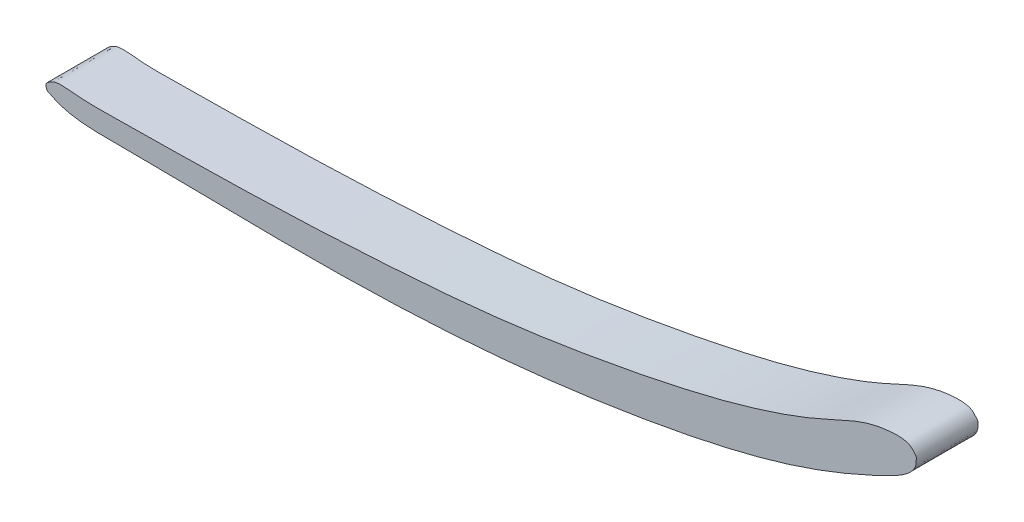
ISO-10303-21;
HEADER;
FILE_DESCRIPTION(('STEP AP214'),'2;1');
FILE_NAME('part.step','',(''),(''),'','','');
FILE_SCHEMA(('AUTOMOTIVE_DESIGN { 1 0 10303 214 1 1 1 1 }'));
ENDSEC;
DATA;
#1=APPLICATION_CONTEXT('core data for automotive mechanical design processes');
#2=APPLICATION_PROTOCOL_DEFINITION('international standard','automotive_design',2000,#1);
#3=PRODUCT_CONTEXT('',#1,'mechanical');
#4=PRODUCT('Part','Part','',(#3));
#5=PRODUCT_RELATED_PRODUCT_CATEGORY('part','',(#4));
#6=PRODUCT_DEFINITION_FORMATION('','',#4);
#7=PRODUCT_DEFINITION_CONTEXT('part definition',#1,'design');
#8=PRODUCT_DEFINITION('design','',#6,#7);
#9=PRODUCT_DEFINITION_SHAPE('','',#8);
#10=(LENGTH_UNIT() NAMED_UNIT(*) SI_UNIT(.MILLI.,.METRE.));
#11=(NAMED_UNIT(*) PLANE_ANGLE_UNIT() SI_UNIT($,.RADIAN.));
#12=(NAMED_UNIT(*) SI_UNIT($,.STERADIAN.) SOLID_ANGLE_UNIT());
#13=UNCERTAINTY_MEASURE_WITH_UNIT(LENGTH_MEASURE(1.E-05),#10,'distance_accuracy_value','');
#14=(GEOMETRIC_REPRESENTATION_CONTEXT(3) GLOBAL_UNCERTAINTY_ASSIGNED_CONTEXT((#13)) GLOBAL_UNIT_ASSIGNED_CONTEXT((#10,
#11,#12)) REPRESENTATION_CONTEXT('',''));
#15=CARTESIAN_POINT('',(0.,0.,0.));
#16=DIRECTION('',(0.,0.,1.));
#17=DIRECTION('',(1.,0.,0.));
#18=AXIS2_PLACEMENT_3D('',#15,#16,#17);
#19=CARTESIAN_POINT('',(53.3117758896389,0.,436.));
#20=CARTESIAN_POINT('',(53.2924026848462,0.0758602378564122,436.));
#21=CARTESIAN_POINT('',(53.2467278687964,0.139159285156232,436.));
#22=CARTESIAN_POINT('',(53.1503918380007,0.259806944950203,436.));
#23=CARTESIAN_POINT('',(53.0986646794505,0.317077317957271,436.));
#24=CARTESIAN_POINT('',(52.9471149825121,0.492004209302732,436.));
#25=CARTESIAN_POINT('',(52.8466524397849,0.610432508046294,436.));
#26=CARTESIAN_POINT('',(52.6783978309807,0.766979000780404,436.));
#27=CARTESIAN_POINT('',(52.619815325509,0.815905581420362,436.));
#28=CARTESIAN_POINT('',(52.4938713708062,0.902315687405925,436.));
#29=CARTESIAN_POINT('',(52.4264511640751,0.940280037854235,436.));
#30=CARTESIAN_POINT('',(52.2153503556903,1.03904826113235,436.));
#31=CARTESIAN_POINT('',(52.0684398127395,1.08283402937068,436.));
#32=CARTESIAN_POINT('',(51.7687117299037,1.14930898014529,436.));
#33=CARTESIAN_POINT('',(51.6151734363124,1.1713739842496,436.));
#34=CARTESIAN_POINT('',(51.3098346330985,1.20362471361882,436.));
#35=CARTESIAN_POINT('',(51.157314347315,1.21351271379425,436.));
#36=CARTESIAN_POINT('',(50.7001470822198,1.22671314723363,436.));
#37=CARTESIAN_POINT('',(50.3958589855501,1.21501388151934,436.));
#38=CARTESIAN_POINT('',(49.4836815115665,1.15118726270128,436.));
#39=CARTESIAN_POINT('',(48.8742839395961,1.06455727948804,436.));
#40=CARTESIAN_POINT('',(47.6837080608175,0.825848229888099,436.));
#41=CARTESIAN_POINT('',(47.0998250757884,0.671336619867735,436.));
#42=CARTESIAN_POINT('',(45.3799647546223,0.109809664935318,436.));
#43=CARTESIAN_POINT('',(44.2730236139548,-0.387008416167067,436.));
#44=CARTESIAN_POINT('',(42.6175644450478,-1.1465483464376,436.));
#45=CARTESIAN_POINT('',(42.0661760715918,-1.40089468343779,436.));
#46=CARTESIAN_POINT('',(40.958588813253,-1.8965798331248,436.));
#47=CARTESIAN_POINT('',(40.4027757567286,-2.13896191778587,436.));
#48=CARTESIAN_POINT('',(38.7244667853285,-2.83671645039119,436.));
#49=CARTESIAN_POINT('',(37.5916504515587,-3.26418269714868,436.));
#50=CARTESIAN_POINT('',(35.3079131153586,-4.07016053763645,436.));
#51=CARTESIAN_POINT('',(34.1569898158811,-4.44866592019819,436.));
#52=CARTESIAN_POINT('',(31.8413286131121,-5.16832227972006,436.));
#53=CARTESIAN_POINT('',(30.6755818504296,-5.50871704075062,436.));
#54=CARTESIAN_POINT('',(28.333861449729,-6.15079805632202,436.));
#55=CARTESIAN_POINT('',(27.1581584814709,-6.45281059441175,436.));
#56=CARTESIAN_POINT('',(23.6196897027133,-7.31421354065079,436.));
#57=CARTESIAN_POINT('',(21.24675994169,-7.83228505152961,436.));
#58=CARTESIAN_POINT('',(16.4891092780133,-8.79765761066856,436.));
#59=CARTESIAN_POINT('',(14.1030125471596,-9.24334085495504,436.));
#60=CARTESIAN_POINT('',(9.31889776092562,-10.0740415498972,436.));
#61=CARTESIAN_POINT('',(6.92125852694406,-10.4586449538477,436.));
#62=CARTESIAN_POINT('',(2.11392175098712,-11.1450967526568,436.));
#63=CARTESIAN_POINT('',(-0.295242499761816,-11.4447759492836,436.));
#64=CARTESIAN_POINT('',(-5.12188937919193,-11.9577543927274,436.));
#65=CARTESIAN_POINT('',(-7.53952796508919,-12.1733952696655,436.));
#66=CARTESIAN_POINT('',(-12.3803996562016,-12.5517177854661,436.));
#67=CARTESIAN_POINT('',(-14.8023958890144,-12.7163512181803,436.));
#68=CARTESIAN_POINT('',(-19.6481830616195,-13.0166660351802,436.));
#69=CARTESIAN_POINT('',(-22.0722733460564,-13.1493699001337,436.));
#70=CARTESIAN_POINT('',(-26.9224242304976,-13.3762304540458,436.));
#71=CARTESIAN_POINT('',(-29.3481937127747,-13.4690177971558,436.));
#72=CARTESIAN_POINT('',(-34.2010231556135,-13.6162096009974,436.));
#73=CARTESIAN_POINT('',(-36.6280914231928,-13.6715379579262,436.));
#74=CARTESIAN_POINT('',(-41.4825872822672,-13.7655224097336,436.));
#75=CARTESIAN_POINT('',(-43.909972764677,-13.8053816696377,436.));
#76=CARTESIAN_POINT('',(-47.5511189437348,-13.8600165212119,436.));
#77=CARTESIAN_POINT('',(-48.7648510065753,-13.8772794718593,436.));
#78=CARTESIAN_POINT('',(-50.5855302211102,-13.8958986816439,436.));
#79=CARTESIAN_POINT('',(-51.192434954409,-13.9023238930158,436.));
#80=CARTESIAN_POINT('',(-52.4062095603995,-13.9118440451594,436.));
#81=CARTESIAN_POINT('',(-53.0130792894998,-13.9144384814104,436.));
#82=CARTESIAN_POINT('',(-54.2265907877619,-13.8915357370193,436.));
#83=CARTESIAN_POINT('',(-54.8334826397777,-13.8641458014162,436.));
#84=CARTESIAN_POINT('',(-55.741758431794,-13.7919730245677,436.));
#85=CARTESIAN_POINT('',(-56.044112929335,-13.7607896789615,436.));
#86=CARTESIAN_POINT('',(-56.6489392616782,-13.700492071634,436.));
#87=CARTESIAN_POINT('',(-56.9515384496869,-13.6736235114415,436.));
#88=CARTESIAN_POINT('',(-57.4068281322975,-13.6578473217736,436.));
#89=CARTESIAN_POINT('',(-57.5588019686673,-13.6563023937686,436.));
#90=CARTESIAN_POINT('',(-57.8635891667981,-13.6680164324404,436.));
#91=CARTESIAN_POINT('',(-58.0175380058452,-13.681491068912,436.));
#92=CARTESIAN_POINT('',(-58.3176730522633,-13.7329422380945,436.));
#93=CARTESIAN_POINT('',(-58.4643214612019,-13.771039622849,436.));
#94=CARTESIAN_POINT('',(-58.7480308516036,-13.8819257560922,436.));
#95=CARTESIAN_POINT('',(-58.8854856347092,-13.9546166340624,436.));
#96=CARTESIAN_POINT('',(-59.0833557752634,-14.0736373733548,436.));
#97=CARTESIAN_POINT('',(-59.147986391791,-14.1155130702567,436.));
#98=CARTESIAN_POINT('',(-59.2756713392829,-14.2018820444326,436.));
#99=CARTESIAN_POINT('',(-59.3407346497934,-14.2435038852301,436.));
#100=CARTESIAN_POINT('',(-59.4305454954696,-14.3165243529279,436.));
#101=CARTESIAN_POINT('',(-59.4585925272692,-14.3432580027624,436.));
#102=CARTESIAN_POINT('',(-59.5048642521898,-14.404157568203,436.));
#103=CARTESIAN_POINT('',(-59.5235914393022,-14.4387121653684,436.));
#104=CARTESIAN_POINT('',(-59.5645465125461,-14.5460667634958,436.));
#105=CARTESIAN_POINT('',(-59.5702202832985,-14.6246168879694,436.));
#106=CARTESIAN_POINT('',(-59.5602408176723,-14.777535659201,436.));
#107=CARTESIAN_POINT('',(-59.5511499967201,-14.8541385622573,436.));
#108=CARTESIAN_POINT('',(-59.5209654665413,-15.0047636381116,436.));
#109=CARTESIAN_POINT('',(-59.4977883361542,-15.0798462968817,436.));
#110=CARTESIAN_POINT('',(-59.4117827844488,-15.2070789180144,436.));
#111=CARTESIAN_POINT('',(-59.3465119100966,-15.2519848307293,436.));
#112=CARTESIAN_POINT('',(-59.2119368740564,-15.3206032224977,436.));
#113=CARTESIAN_POINT('',(-59.1412424073977,-15.3479914414723,436.));
#114=CARTESIAN_POINT('',(-58.7949724582257,-15.4995636739074,436.));
#115=CARTESIAN_POINT('',(-58.5303965775519,-15.6489935920551,436.));
#116=CARTESIAN_POINT('',(-57.9783651911049,-15.8930036725637,436.));
#117=CARTESIAN_POINT('',(-57.6925852721282,-15.990385246316,436.));
#118=CARTESIAN_POINT('',(-57.1101426355883,-16.1577041055364,436.));
#119=CARTESIAN_POINT('',(-56.8143800231552,-16.2285402307878,436.));
#120=CARTESIAN_POINT('',(-56.2209726779825,-16.3515009001225,436.));
#121=CARTESIAN_POINT('',(-55.9223856481892,-16.403029038198,436.));
#122=CARTESIAN_POINT('',(-55.0216735747282,-16.5314510405812,436.));
#123=CARTESIAN_POINT('',(-54.4167249955589,-16.5817261414553,436.));
#124=CARTESIAN_POINT('',(-53.2073559081699,-16.6467920780263,436.));
#125=CARTESIAN_POINT('',(-52.6018239163977,-16.6625186142064,436.));
#126=CARTESIAN_POINT('',(-50.7841508903534,-16.6883383537372,436.));
#127=CARTESIAN_POINT('',(-49.5717661341431,-16.6835243764088,436.));
#128=CARTESIAN_POINT('',(-47.1475064765481,-16.6854169709471,436.));
#129=CARTESIAN_POINT('',(-45.9353913330778,-16.6899262367382,436.));
#130=CARTESIAN_POINT('',(-42.2991202853967,-16.7215008451385,436.));
#131=CARTESIAN_POINT('',(-39.8751251169339,-16.762512794779,436.));
#132=CARTESIAN_POINT('',(-35.0271191570887,-16.8388324412898,436.));
#133=CARTESIAN_POINT('',(-32.6030429125295,-16.871014753095,436.));
#134=CARTESIAN_POINT('',(-25.3301932913842,-16.916904753438,436.));
#135=CARTESIAN_POINT('',(-20.4821249895782,-16.8758608033369,436.));
#136=CARTESIAN_POINT('',(-10.7905152724948,-16.5550559898871,436.));
#137=CARTESIAN_POINT('',(-5.94956608478794,-16.2804264694768,436.));
#138=CARTESIAN_POINT('',(3.70917705833322,-15.4284327066827,436.));
#139=CARTESIAN_POINT('',(8.52438706750984,-14.8507310483279,436.));
#140=CARTESIAN_POINT('',(15.7155933474987,-13.7713937222307,436.));
#141=CARTESIAN_POINT('',(18.108570446821,-13.3767789438654,436.));
#142=CARTESIAN_POINT('',(22.877281107572,-12.5098766058601,436.));
#143=CARTESIAN_POINT('',(25.2537830166688,-12.0375555295738,436.));
#144=CARTESIAN_POINT('',(29.9843028115873,-10.9816304254003,436.));
#145=CARTESIAN_POINT('',(32.3397610649834,-10.3953357966798,436.));
#146=CARTESIAN_POINT('',(36.9988668368674,-9.05462875404475,436.));
#147=CARTESIAN_POINT('',(39.3052839376106,-8.29679195262606,436.));
#148=CARTESIAN_POINT('',(43.8421600276826,-6.58228330160254,436.));
#149=CARTESIAN_POINT('',(46.0738652129147,-5.62563738457181,436.));
#150=CARTESIAN_POINT('',(48.818732162713,-4.33680716405205,436.));
#151=CARTESIAN_POINT('',(49.365713657546,-4.07443669957599,436.));
#152=CARTESIAN_POINT('',(50.1768324571656,-3.66259874691369,436.));
#153=CARTESIAN_POINT('',(50.4452805806202,-3.52173939145187,436.));
#154=CARTESIAN_POINT('',(50.9754401492382,-3.2274908377059,436.));
#155=CARTESIAN_POINT('',(51.2380694219104,-3.07440836745271,436.));
#156=CARTESIAN_POINT('',(51.7459371827672,-2.74621649414777,436.));
#157=CARTESIAN_POINT('',(51.9913373473091,-2.57103062868122,436.));
#158=CARTESIAN_POINT('',(52.4530504108351,-2.1828587519819,436.));
#159=CARTESIAN_POINT('',(52.6706950854035,-1.96606670726904,436.));
#160=CARTESIAN_POINT('',(52.9506869887328,-1.60538994521381,436.));
#161=CARTESIAN_POINT('',(53.0368004072569,-1.47929374796479,436.));
#162=CARTESIAN_POINT('',(53.1818406642536,-1.20937749837996,436.));
#163=CARTESIAN_POINT('',(53.2395813073663,-1.06913135718228,436.));
#164=CARTESIAN_POINT('',(53.3016773198267,-0.769538125322267,436.));
#165=CARTESIAN_POINT('',(53.3024911330265,-0.613919339002539,436.));
#166=CARTESIAN_POINT('',(53.3066009239745,-0.383720642859048,436.));
#167=CARTESIAN_POINT('',(53.3112938239223,-0.307099157497964,436.));
#168=CARTESIAN_POINT('',(53.3224238492843,-0.153914667601784,436.));
#169=CARTESIAN_POINT('',(53.3311490944316,-0.0758602378564122,436.));
#170=CARTESIAN_POINT('',(53.3117758896389,0.,436.));
#171=B_SPLINE_CURVE_WITH_KNOTS('',3,(#19,#20,#21,#22,#23,#24,#25,#26,#27,#28,#29,#30,#31,#32,
#33,#34,#35,#36,#37,#38,#39,#40,#41,#42,#43,#44,#45,#46,#47,#48,#49,#50,#51,#52,#53,#54,#55,#56,
#57,#58,#59,#60,#61,#62,#63,#64,#65,#66,#67,#68,#69,#70,#71,#72,#73,#74,#75,#76,#77,#78,#79,#80,
#81,#82,#83,#84,#85,#86,#87,#88,#89,#90,#91,#92,#93,#94,#95,#96,#97,#98,#99,#100,#101,#102,#103,
#104,#105,#106,#107,#108,#109,#110,#111,#112,#113,#114,#115,#116,#117,#118,#119,#120,#121,#122,
#123,#124,#125,#126,#127,#128,#129,#130,#131,#132,#133,#134,#135,#136,#137,#138,#139,#140,#141,
#142,#143,#144,#145,#146,#147,#148,#149,#150,#151,#152,#153,#154,#155,#156,#157,#158,#159,#160,
#161,#162,#163,#164,#165,#166,#167,#168,#169,#170),.UNSPECIFIED.,.T.,.F.,(4,2,2,2,2,2,2,2,2,2,2,
2,2,2,2,2,2,2,2,2,2,2,2,2,2,2,2,2,2,2,2,2,2,2,2,2,2,2,2,2,2,2,2,2,2,2,2,2,2,2,2,2,2,2,2,2,2,2,2,
2,2,2,2,2,2,2,2,2,2,2,2,2,2,2,2,4),(0.,0.000976562500000017,0.00195312500000003,
0.00390625000000001,0.0048828125,0.00585937499999999,0.00781249999999997,0.00976562499999994,
0.0117187499999999,0.0156249999999999,0.0234374999999997,0.0312499999999995,0.0468749999999992,
0.054687499999999,0.0624999999999987,0.0781249999999983,0.0937499999999979,0.109374999999997,
0.124999999999997,0.156249999999996,0.187499999999995,0.218749999999994,0.249999999999993,
0.281249999999992,0.312499999999992,0.343749999999991,0.37499999999999,0.406249999999989,
0.437499999999988,0.453124999999987,0.460937499999987,0.468749999999987,0.476562499999987,
0.480468749999987,0.484374999999987,0.486328124999987,0.488281249999987,0.490234374999987,
0.492187499999987,0.493164062499987,0.494140624999986,0.494628906249986,0.495117187499986,
0.496093749999987,0.497070312499987,0.498046874999987,0.499023437499987,0.499999999999987,
0.503906249999987,0.507812499999987,0.511718749999987,0.515624999999987,0.523437499999987,
0.531249999999987,0.546874999999988,0.562499999999988,0.593749999999989,0.62499999999999,
0.687499999999992,0.749999999999993,0.812499999999995,0.843749999999996,0.874999999999997,
0.906249999999998,0.937499999999999,0.968749999999999,0.9765625,0.98046875,0.984375,0.98828125,
0.9921875,0.994140625,0.99609375,0.998046875,0.9990234375,1.),.UNSPECIFIED.);
#172=DIRECTION('',(0.,0.,-1.));
#173=VECTOR('',#172,1.);
#174=SURFACE_OF_LINEAR_EXTRUSION('',#171,#173);
#175=CARTESIAN_POINT('',(53.3117758896389,0.,436.));
#176=CARTESIAN_POINT('',(53.3311490944316,-0.0758602378564122,436.));
#177=CARTESIAN_POINT('',(53.3224238492843,-0.153914667601784,436.));
#178=CARTESIAN_POINT('',(53.3112938239223,-0.307099157497964,436.));
#179=CARTESIAN_POINT('',(53.3066009239745,-0.383720642859048,436.));
#180=CARTESIAN_POINT('',(53.3024911330265,-0.613919339002539,436.));
#181=CARTESIAN_POINT('',(53.3016773198267,-0.769538125322267,436.));
#182=CARTESIAN_POINT('',(53.2395813073663,-1.06913135718228,436.));
#183=CARTESIAN_POINT('',(53.1818406642536,-1.20937749837996,436.));
#184=CARTESIAN_POINT('',(53.0368004072569,-1.47929374796479,436.));
#185=CARTESIAN_POINT('',(52.9506869887328,-1.60538994521381,436.));
#186=CARTESIAN_POINT('',(52.6706950854035,-1.96606670726904,436.));
#187=CARTESIAN_POINT('',(52.4530504108351,-2.1828587519819,436.));
#188=CARTESIAN_POINT('',(51.9913373473091,-2.57103062868122,436.));
#189=CARTESIAN_POINT('',(51.7459371827672,-2.74621649414777,436.));
#190=CARTESIAN_POINT('',(51.2380694219104,-3.07440836745271,436.));
#191=CARTESIAN_POINT('',(50.9754401492382,-3.2274908377059,436.));
#192=CARTESIAN_POINT('',(50.4452805806202,-3.52173939145187,436.));
#193=CARTESIAN_POINT('',(50.1768324571656,-3.66259874691369,436.));
#194=CARTESIAN_POINT('',(49.365713657546,-4.07443669957599,436.));
#195=CARTESIAN_POINT('',(48.818732162713,-4.33680716405205,436.));
#196=CARTESIAN_POINT('',(46.0738652129147,-5.62563738457181,436.));
#197=CARTESIAN_POINT('',(43.8421600276826,-6.58228330160254,436.));
#198=CARTESIAN_POINT('',(39.3052839376106,-8.29679195262606,436.));
#199=CARTESIAN_POINT('',(36.9988668368674,-9.05462875404475,436.));
#200=CARTESIAN_POINT('',(32.3397610649834,-10.3953357966798,436.));
#201=CARTESIAN_POINT('',(29.9843028115873,-10.9816304254003,436.));
#202=CARTESIAN_POINT('',(25.2537830166688,-12.0375555295738,436.));
#203=CARTESIAN_POINT('',(22.877281107572,-12.5098766058601,436.));
#204=CARTESIAN_POINT('',(18.108570446821,-13.3767789438654,436.));
#205=CARTESIAN_POINT('',(15.7155933474987,-13.7713937222307,436.));
#206=CARTESIAN_POINT('',(8.52438706750984,-14.8507310483279,436.));
#207=CARTESIAN_POINT('',(3.70917705833322,-15.4284327066827,436.));
#208=CARTESIAN_POINT('',(-5.94956608478794,-16.2804264694768,436.));
#209=CARTESIAN_POINT('',(-10.7905152724948,-16.5550559898871,436.));
#210=CARTESIAN_POINT('',(-20.4821249895782,-16.8758608033369,436.));
#211=CARTESIAN_POINT('',(-25.3301932913842,-16.916904753438,436.));
#212=CARTESIAN_POINT('',(-32.6030429125295,-16.871014753095,436.));
#213=CARTESIAN_POINT('',(-35.0271191570887,-16.8388324412898,436.));
#214=CARTESIAN_POINT('',(-39.8751251169339,-16.762512794779,436.));
#215=CARTESIAN_POINT('',(-42.2991202853967,-16.7215008451385,436.));
#216=CARTESIAN_POINT('',(-45.9353913330778,-16.6899262367382,436.));
#217=CARTESIAN_POINT('',(-47.1475064765481,-16.6854169709471,436.));
#218=CARTESIAN_POINT('',(-49.5717661341431,-16.6835243764088,436.));
#219=CARTESIAN_POINT('',(-50.7841508903534,-16.6883383537372,436.));
#220=CARTESIAN_POINT('',(-52.6018239163977,-16.6625186142064,436.));
#221=CARTESIAN_POINT('',(-53.2073559081699,-16.6467920780263,436.));
#222=CARTESIAN_POINT('',(-54.4167249955589,-16.5817261414553,436.));
#223=CARTESIAN_POINT('',(-55.0216735747282,-16.5314510405812,436.));
#224=CARTESIAN_POINT('',(-55.9223856481892,-16.403029038198,436.));
#225=CARTESIAN_POINT('',(-56.2209726779825,-16.3515009001225,436.));
#226=CARTESIAN_POINT('',(-56.8143800231552,-16.2285402307878,436.));
#227=CARTESIAN_POINT('',(-57.1101426355883,-16.1577041055364,436.));
#228=CARTESIAN_POINT('',(-57.6925852721282,-15.990385246316,436.));
#229=CARTESIAN_POINT('',(-57.9783651911049,-15.8930036725637,436.));
#230=CARTESIAN_POINT('',(-58.5303965775519,-15.6489935920551,436.));
#231=CARTESIAN_POINT('',(-58.7949724582257,-15.4995636739074,436.));
#232=CARTESIAN_POINT('',(-59.1412424073977,-15.3479914414723,436.));
#233=CARTESIAN_POINT('',(-59.2119368740564,-15.3206032224977,436.));
#234=CARTESIAN_POINT('',(-59.3465119100966,-15.2519848307293,436.));
#235=CARTESIAN_POINT('',(-59.4117827844488,-15.2070789180144,436.));
#236=CARTESIAN_POINT('',(-59.4977883361542,-15.0798462968817,436.));
#237=CARTESIAN_POINT('',(-59.5209654665413,-15.0047636381116,436.));
#238=CARTESIAN_POINT('',(-59.5511499967201,-14.8541385622573,436.));
#239=CARTESIAN_POINT('',(-59.5602408176723,-14.777535659201,436.));
#240=CARTESIAN_POINT('',(-59.5702202832985,-14.6246168879694,436.));
#241=CARTESIAN_POINT('',(-59.5645465125461,-14.5460667634958,436.));
#242=CARTESIAN_POINT('',(-59.5235914393022,-14.4387121653684,436.));
#243=CARTESIAN_POINT('',(-59.5048642521898,-14.404157568203,436.));
#244=CARTESIAN_POINT('',(-59.4585925272692,-14.3432580027624,436.));
#245=CARTESIAN_POINT('',(-59.4305454954696,-14.3165243529279,436.));
#246=CARTESIAN_POINT('',(-59.3407346497934,-14.2435038852301,436.));
#247=CARTESIAN_POINT('',(-59.2756713392829,-14.2018820444326,436.));
#248=CARTESIAN_POINT('',(-59.147986391791,-14.1155130702567,436.));
#249=CARTESIAN_POINT('',(-59.0833557752634,-14.0736373733548,436.));
#250=CARTESIAN_POINT('',(-58.8854856347092,-13.9546166340624,436.));
#251=CARTESIAN_POINT('',(-58.7480308516036,-13.8819257560922,436.));
#252=CARTESIAN_POINT('',(-58.4643214612019,-13.771039622849,436.));
#253=CARTESIAN_POINT('',(-58.3176730522633,-13.7329422380945,436.));
#254=CARTESIAN_POINT('',(-58.0175380058452,-13.681491068912,436.));
#255=CARTESIAN_POINT('',(-57.8635891667981,-13.6680164324404,436.));
#256=CARTESIAN_POINT('',(-57.5588019686673,-13.6563023937686,436.));
#257=CARTESIAN_POINT('',(-57.4068281322975,-13.6578473217736,436.));
#258=CARTESIAN_POINT('',(-56.9515384496869,-13.6736235114415,436.));
#259=CARTESIAN_POINT('',(-56.6489392616782,-13.700492071634,436.));
#260=CARTESIAN_POINT('',(-56.044112929335,-13.7607896789615,436.));
#261=CARTESIAN_POINT('',(-55.741758431794,-13.7919730245677,436.));
#262=CARTESIAN_POINT('',(-54.8334826397777,-13.8641458014162,436.));
#263=CARTESIAN_POINT('',(-54.2265907877619,-13.8915357370193,436.));
#264=CARTESIAN_POINT('',(-53.0130792894998,-13.9144384814104,436.));
#265=CARTESIAN_POINT('',(-52.4062095603995,-13.9118440451594,436.));
#266=CARTESIAN_POINT('',(-51.192434954409,-13.9023238930158,436.));
#267=CARTESIAN_POINT('',(-50.5855302211102,-13.8958986816439,436.));
#268=CARTESIAN_POINT('',(-48.7648510065753,-13.8772794718593,436.));
#269=CARTESIAN_POINT('',(-47.5511189437348,-13.8600165212119,436.));
#270=CARTESIAN_POINT('',(-43.909972764677,-13.8053816696377,436.));
#271=CARTESIAN_POINT('',(-41.4825872822672,-13.7655224097336,436.));
#272=CARTESIAN_POINT('',(-36.6280914231928,-13.6715379579262,436.));
#273=CARTESIAN_POINT('',(-34.2010231556135,-13.6162096009974,436.));
#274=CARTESIAN_POINT('',(-29.3481937127747,-13.4690177971558,436.));
#275=CARTESIAN_POINT('',(-26.9224242304976,-13.3762304540458,436.));
#276=CARTESIAN_POINT('',(-22.0722733460564,-13.1493699001337,436.));
#277=CARTESIAN_POINT('',(-19.6481830616195,-13.0166660351802,436.));
#278=CARTESIAN_POINT('',(-14.8023958890144,-12.7163512181803,436.));
#279=CARTESIAN_POINT('',(-12.3803996562016,-12.5517177854661,436.));
#280=CARTESIAN_POINT('',(-7.53952796508919,-12.1733952696655,436.));
#281=CARTESIAN_POINT('',(-5.12188937919193,-11.9577543927274,436.));
#282=CARTESIAN_POINT('',(-0.295242499761816,-11.4447759492836,436.));
#283=CARTESIAN_POINT('',(2.11392175098712,-11.1450967526568,436.));
#284=CARTESIAN_POINT('',(6.92125852694406,-10.4586449538477,436.));
#285=CARTESIAN_POINT('',(9.31889776092562,-10.0740415498972,436.));
#286=CARTESIAN_POINT('',(14.1030125471596,-9.24334085495504,436.));
#287=CARTESIAN_POINT('',(16.4891092780133,-8.79765761066856,436.));
#288=CARTESIAN_POINT('',(21.24675994169,-7.83228505152961,436.));
#289=CARTESIAN_POINT('',(23.6196897027133,-7.31421354065079,436.));
#290=CARTESIAN_POINT('',(27.1581584814709,-6.45281059441175,436.));
#291=CARTESIAN_POINT('',(28.333861449729,-6.15079805632202,436.));
#292=CARTESIAN_POINT('',(30.6755818504296,-5.50871704075062,436.));
#293=CARTESIAN_POINT('',(31.8413286131121,-5.16832227972006,436.));
#294=CARTESIAN_POINT('',(34.1569898158811,-4.44866592019819,436.));
#295=CARTESIAN_POINT('',(35.3079131153586,-4.07016053763645,436.));
#296=CARTESIAN_POINT('',(37.5916504515587,-3.26418269714868,436.));
#297=CARTESIAN_POINT('',(38.7244667853285,-2.83671645039119,436.));
#298=CARTESIAN_POINT('',(40.4027757567286,-2.13896191778587,436.));
#299=CARTESIAN_POINT('',(40.958588813253,-1.8965798331248,436.));
#300=CARTESIAN_POINT('',(42.0661760715918,-1.40089468343779,436.));
#301=CARTESIAN_POINT('',(42.6175644450478,-1.1465483464376,436.));
#302=CARTESIAN_POINT('',(44.2730236139548,-0.387008416167067,436.));
#303=CARTESIAN_POINT('',(45.3799647546223,0.109809664935318,436.));
#304=CARTESIAN_POINT('',(47.0998250757884,0.671336619867735,436.));
#305=CARTESIAN_POINT('',(47.6837080608175,0.825848229888099,436.));
#306=CARTESIAN_POINT('',(48.8742839395961,1.06455727948804,436.));
#307=CARTESIAN_POINT('',(49.4836815115665,1.15118726270128,436.));
#308=CARTESIAN_POINT('',(50.3958589855501,1.21501388151934,436.));
#309=CARTESIAN_POINT('',(50.7001470822198,1.22671314723363,436.));
#310=CARTESIAN_POINT('',(51.157314347315,1.21351271379425,436.));
#311=CARTESIAN_POINT('',(51.3098346330985,1.20362471361882,436.));
#312=CARTESIAN_POINT('',(51.6151734363124,1.1713739842496,436.));
#313=CARTESIAN_POINT('',(51.7687117299037,1.14930898014529,436.));
#314=CARTESIAN_POINT('',(52.0684398127395,1.08283402937068,436.));
#315=CARTESIAN_POINT('',(52.2153503556903,1.03904826113235,436.));
#316=CARTESIAN_POINT('',(52.4264511640751,0.940280037854235,436.));
#317=CARTESIAN_POINT('',(52.4938713708062,0.902315687405925,436.));
#318=CARTESIAN_POINT('',(52.619815325509,0.815905581420362,436.));
#319=CARTESIAN_POINT('',(52.6783978309807,0.766979000780404,436.));
#320=CARTESIAN_POINT('',(52.8466524397849,0.610432508046294,436.));
#321=CARTESIAN_POINT('',(52.9471149825121,0.492004209302732,436.));
#322=CARTESIAN_POINT('',(53.0986646794505,0.317077317957271,436.));
#323=CARTESIAN_POINT('',(53.1503918380007,0.259806944950203,436.));
#324=CARTESIAN_POINT('',(53.2467278687964,0.139159285156232,436.));
#325=CARTESIAN_POINT('',(53.2924026848462,0.0758602378564122,436.));
#326=CARTESIAN_POINT('',(53.3117758896389,0.,436.));
#327=B_SPLINE_CURVE_WITH_KNOTS('',3,(#175,#176,#177,#178,#179,#180,#181,#182,#183,#184,#185,
#186,#187,#188,#189,#190,#191,#192,#193,#194,#195,#196,#197,#198,#199,#200,#201,#202,#203,#204,
#205,#206,#207,#208,#209,#210,#211,#212,#213,#214,#215,#216,#217,#218,#219,#220,#221,#222,#223,
#224,#225,#226,#227,#228,#229,#230,#231,#232,#233,#234,#235,#236,#237,#238,#239,#240,#241,#242,
#243,#244,#245,#246,#247,#248,#249,#250,#251,#252,#253,#254,#255,#256,#257,#258,#259,#260,#261,
#262,#263,#264,#265,#266,#267,#268,#269,#270,#271,#272,#273,#274,#275,#276,#277,#278,#279,#280,
#281,#282,#283,#284,#285,#286,#287,#288,#289,#290,#291,#292,#293,#294,#295,#296,#297,#298,#299,
#300,#301,#302,#303,#304,#305,#306,#307,#308,#309,#310,#311,#312,#313,#314,#315,#316,#317,#318,
#319,#320,#321,#322,#323,#324,#325,#326),.UNSPECIFIED.,.T.,.F.,(4,2,2,2,2,2,2,2,2,2,2,2,2,2,2,2,
2,2,2,2,2,2,2,2,2,2,2,2,2,2,2,2,2,2,2,2,2,2,2,2,2,2,2,2,2,2,2,2,2,2,2,2,2,2,2,2,2,2,2,2,2,2,2,2,
2,2,2,2,2,2,2,2,2,2,2,4),(0.,0.000976562499999889,0.00195312499999989,0.00390625,0.005859375,
0.0078125,0.0117187500000001,0.0156250000000001,0.0195312500000002,0.0234375000000003,
0.0312500000000006,0.0625000000000014,0.0937500000000023,0.125000000000003,0.156250000000004,
0.187500000000005,0.250000000000007,0.312500000000008,0.37500000000001,0.406250000000011,
0.437500000000012,0.453125000000012,0.468750000000013,0.476562500000013,0.484375000000013,
0.488281250000013,0.492187500000013,0.496093750000013,0.500000000000013,0.500976562500013,
0.501953125000014,0.502929687500014,0.503906250000014,0.504882812500014,0.505371093750014,
0.505859375000014,0.506835937500014,0.507812500000013,0.509765625000013,0.511718750000013,
0.513671875000013,0.515625000000013,0.519531250000013,0.523437500000013,0.531250000000013,
0.539062500000013,0.546875000000013,0.562500000000012,0.593750000000011,0.62500000000001,
0.656250000000009,0.687500000000008,0.718750000000008,0.750000000000007,0.781250000000006,
0.812500000000005,0.843750000000004,0.875000000000003,0.890625000000003,0.906250000000002,
0.921875000000002,0.937500000000001,0.945312500000001,0.953125000000001,0.96875,0.9765625,
0.984375,0.98828125,0.990234375,0.9921875,0.994140625,0.9951171875,0.99609375,0.998046875,
0.9990234375,1.),.UNSPECIFIED.);
#328=CARTESIAN_POINT('',(53.3117758896389,0.,436.));
#329=VERTEX_POINT('',#328);
#330=EDGE_CURVE('E10',#329,#329,#327,.F.);
#331=ORIENTED_EDGE('',*,*,#330,.F.);
#332=EDGE_LOOP('',(#331));
#333=FACE_BOUND('',#332,.T.);
#334=CARTESIAN_POINT('',(53.3117758896389,0.,428.));
#335=CARTESIAN_POINT('',(53.2924026848462,0.0758602378564122,428.));
#336=CARTESIAN_POINT('',(53.2467278687964,0.139159285156232,428.));
#337=CARTESIAN_POINT('',(53.1503918380007,0.259806944950203,428.));
#338=CARTESIAN_POINT('',(53.0986646794505,0.317077317957271,428.));
#339=CARTESIAN_POINT('',(52.9471149825121,0.492004209302732,428.));
#340=CARTESIAN_POINT('',(52.8466524397849,0.610432508046294,428.));
#341=CARTESIAN_POINT('',(52.6783978309807,0.766979000780404,428.));
#342=CARTESIAN_POINT('',(52.619815325509,0.815905581420362,428.));
#343=CARTESIAN_POINT('',(52.4938713708062,0.902315687405925,428.));
#344=CARTESIAN_POINT('',(52.4264511640751,0.940280037854235,428.));
#345=CARTESIAN_POINT('',(52.2153503556903,1.03904826113235,428.));
#346=CARTESIAN_POINT('',(52.0684398127395,1.08283402937068,428.));
#347=CARTESIAN_POINT('',(51.7687117299037,1.14930898014529,428.));
#348=CARTESIAN_POINT('',(51.6151734363124,1.1713739842496,428.));
#349=CARTESIAN_POINT('',(51.3098346330985,1.20362471361882,428.));
#350=CARTESIAN_POINT('',(51.157314347315,1.21351271379425,428.));
#351=CARTESIAN_POINT('',(50.7001470822198,1.22671314723363,428.));
#352=CARTESIAN_POINT('',(50.3958589855501,1.21501388151934,428.));
#353=CARTESIAN_POINT('',(49.4836815115665,1.15118726270128,428.));
#354=CARTESIAN_POINT('',(48.8742839395961,1.06455727948804,428.));
#355=CARTESIAN_POINT('',(47.6837080608175,0.825848229888099,428.));
#356=CARTESIAN_POINT('',(47.0998250757884,0.671336619867735,428.));
#357=CARTESIAN_POINT('',(45.3799647546223,0.109809664935318,428.));
#358=CARTESIAN_POINT('',(44.2730236139548,-0.387008416167067,428.));
#359=CARTESIAN_POINT('',(42.6175644450478,-1.1465483464376,428.));
#360=CARTESIAN_POINT('',(42.0661760715918,-1.40089468343779,428.));
#361=CARTESIAN_POINT('',(40.958588813253,-1.8965798331248,428.));
#362=CARTESIAN_POINT('',(40.4027757567286,-2.13896191778587,428.));
#363=CARTESIAN_POINT('',(38.7244667853285,-2.83671645039119,428.));
#364=CARTESIAN_POINT('',(37.5916504515587,-3.26418269714868,428.));
#365=CARTESIAN_POINT('',(35.3079131153586,-4.07016053763645,428.));
#366=CARTESIAN_POINT('',(34.1569898158811,-4.44866592019819,428.));
#367=CARTESIAN_POINT('',(31.8413286131121,-5.16832227972006,428.));
#368=CARTESIAN_POINT('',(30.6755818504296,-5.50871704075062,428.));
#369=CARTESIAN_POINT('',(28.333861449729,-6.15079805632202,428.));
#370=CARTESIAN_POINT('',(27.1581584814709,-6.45281059441175,428.));
#371=CARTESIAN_POINT('',(23.6196897027133,-7.31421354065079,428.));
#372=CARTESIAN_POINT('',(21.24675994169,-7.83228505152961,428.));
#373=CARTESIAN_POINT('',(16.4891092780133,-8.79765761066856,428.));
#374=CARTESIAN_POINT('',(14.1030125471596,-9.24334085495504,428.));
#375=CARTESIAN_POINT('',(9.31889776092562,-10.0740415498972,428.));
#376=CARTESIAN_POINT('',(6.92125852694406,-10.4586449538477,428.));
#377=CARTESIAN_POINT('',(2.11392175098712,-11.1450967526568,428.));
#378=CARTESIAN_POINT('',(-0.295242499761816,-11.4447759492836,428.));
#379=CARTESIAN_POINT('',(-5.12188937919193,-11.9577543927274,428.));
#380=CARTESIAN_POINT('',(-7.53952796508919,-12.1733952696655,428.));
#381=CARTESIAN_POINT('',(-12.3803996562016,-12.5517177854661,428.));
#382=CARTESIAN_POINT('',(-14.8023958890144,-12.7163512181803,428.));
#383=CARTESIAN_POINT('',(-19.6481830616195,-13.0166660351802,428.));
#384=CARTESIAN_POINT('',(-22.0722733460564,-13.1493699001337,428.));
#385=CARTESIAN_POINT('',(-26.9224242304976,-13.3762304540458,428.));
#386=CARTESIAN_POINT('',(-29.3481937127747,-13.4690177971558,428.));
#387=CARTESIAN_POINT('',(-34.2010231556135,-13.6162096009974,428.));
#388=CARTESIAN_POINT('',(-36.6280914231928,-13.6715379579262,428.));
#389=CARTESIAN_POINT('',(-41.4825872822672,-13.7655224097336,428.));
#390=CARTESIAN_POINT('',(-43.909972764677,-13.8053816696377,428.));
#391=CARTESIAN_POINT('',(-47.5511189437348,-13.8600165212119,428.));
#392=CARTESIAN_POINT('',(-48.7648510065753,-13.8772794718593,428.));
#393=CARTESIAN_POINT('',(-50.5855302211102,-13.8958986816439,428.));
#394=CARTESIAN_POINT('',(-51.192434954409,-13.9023238930158,428.));
#395=CARTESIAN_POINT('',(-52.4062095603995,-13.9118440451594,428.));
#396=CARTESIAN_POINT('',(-53.0130792894998,-13.9144384814104,428.));
#397=CARTESIAN_POINT('',(-54.2265907877619,-13.8915357370193,428.));
#398=CARTESIAN_POINT('',(-54.8334826397777,-13.8641458014162,428.));
#399=CARTESIAN_POINT('',(-55.741758431794,-13.7919730245677,428.));
#400=CARTESIAN_POINT('',(-56.044112929335,-13.7607896789615,428.));
#401=CARTESIAN_POINT('',(-56.6489392616782,-13.700492071634,428.));
#402=CARTESIAN_POINT('',(-56.9515384496869,-13.6736235114415,428.));
#403=CARTESIAN_POINT('',(-57.4068281322975,-13.6578473217736,428.));
#404=CARTESIAN_POINT('',(-57.5588019686673,-13.6563023937686,428.));
#405=CARTESIAN_POINT('',(-57.8635891667981,-13.6680164324404,428.));
#406=CARTESIAN_POINT('',(-58.0175380058452,-13.681491068912,428.));
#407=CARTESIAN_POINT('',(-58.3176730522633,-13.7329422380945,428.));
#408=CARTESIAN_POINT('',(-58.4643214612019,-13.771039622849,428.));
#409=CARTESIAN_POINT('',(-58.7480308516036,-13.8819257560922,428.));
#410=CARTESIAN_POINT('',(-58.8854856347092,-13.9546166340624,428.));
#411=CARTESIAN_POINT('',(-59.0833557752634,-14.0736373733548,428.));
#412=CARTESIAN_POINT('',(-59.147986391791,-14.1155130702567,428.));
#413=CARTESIAN_POINT('',(-59.2756713392829,-14.2018820444326,428.));
#414=CARTESIAN_POINT('',(-59.3407346497934,-14.2435038852301,428.));
#415=CARTESIAN_POINT('',(-59.4305454954696,-14.3165243529279,428.));
#416=CARTESIAN_POINT('',(-59.4585925272692,-14.3432580027624,428.));
#417=CARTESIAN_POINT('',(-59.5048642521898,-14.404157568203,428.));
#418=CARTESIAN_POINT('',(-59.5235914393022,-14.4387121653684,428.));
#419=CARTESIAN_POINT('',(-59.5645465125461,-14.5460667634958,428.));
#420=CARTESIAN_POINT('',(-59.5702202832985,-14.6246168879694,428.));
#421=CARTESIAN_POINT('',(-59.5602408176723,-14.777535659201,428.));
#422=CARTESIAN_POINT('',(-59.5511499967201,-14.8541385622573,428.));
#423=CARTESIAN_POINT('',(-59.5209654665413,-15.0047636381116,428.));
#424=CARTESIAN_POINT('',(-59.4977883361542,-15.0798462968817,428.));
#425=CARTESIAN_POINT('',(-59.4117827844488,-15.2070789180144,428.));
#426=CARTESIAN_POINT('',(-59.3465119100966,-15.2519848307293,428.));
#427=CARTESIAN_POINT('',(-59.2119368740564,-15.3206032224977,428.));
#428=CARTESIAN_POINT('',(-59.1412424073977,-15.3479914414723,428.));
#429=CARTESIAN_POINT('',(-58.7949724582257,-15.4995636739074,428.));
#430=CARTESIAN_POINT('',(-58.5303965775519,-15.6489935920551,428.));
#431=CARTESIAN_POINT('',(-57.9783651911049,-15.8930036725637,428.));
#432=CARTESIAN_POINT('',(-57.6925852721282,-15.990385246316,428.));
#433=CARTESIAN_POINT('',(-57.1101426355883,-16.1577041055364,428.));
#434=CARTESIAN_POINT('',(-56.8143800231552,-16.2285402307878,428.));
#435=CARTESIAN_POINT('',(-56.2209726779825,-16.3515009001225,428.));
#436=CARTESIAN_POINT('',(-55.9223856481892,-16.403029038198,428.));
#437=CARTESIAN_POINT('',(-55.0216735747282,-16.5314510405812,428.));
#438=CARTESIAN_POINT('',(-54.4167249955589,-16.5817261414553,428.));
#439=CARTESIAN_POINT('',(-53.2073559081699,-16.6467920780263,428.));
#440=CARTESIAN_POINT('',(-52.6018239163977,-16.6625186142064,428.));
#441=CARTESIAN_POINT('',(-50.7841508903534,-16.6883383537372,428.));
#442=CARTESIAN_POINT('',(-49.5717661341431,-16.6835243764088,428.));
#443=CARTESIAN_POINT('',(-47.1475064765481,-16.6854169709471,428.));
#444=CARTESIAN_POINT('',(-45.9353913330778,-16.6899262367382,428.));
#445=CARTESIAN_POINT('',(-42.2991202853967,-16.7215008451385,428.));
#446=CARTESIAN_POINT('',(-39.8751251169339,-16.762512794779,428.));
#447=CARTESIAN_POINT('',(-35.0271191570887,-16.8388324412898,428.));
#448=CARTESIAN_POINT('',(-32.6030429125295,-16.871014753095,428.));
#449=CARTESIAN_POINT('',(-25.3301932913842,-16.916904753438,428.));
#450=CARTESIAN_POINT('',(-20.4821249895782,-16.8758608033369,428.));
#451=CARTESIAN_POINT('',(-10.7905152724948,-16.5550559898871,428.));
#452=CARTESIAN_POINT('',(-5.94956608478794,-16.2804264694768,428.));
#453=CARTESIAN_POINT('',(3.70917705833322,-15.4284327066827,428.));
#454=CARTESIAN_POINT('',(8.52438706750984,-14.8507310483279,428.));
#455=CARTESIAN_POINT('',(15.7155933474987,-13.7713937222307,428.));
#456=CARTESIAN_POINT('',(18.108570446821,-13.3767789438654,428.));
#457=CARTESIAN_POINT('',(22.877281107572,-12.5098766058601,428.));
#458=CARTESIAN_POINT('',(25.2537830166688,-12.0375555295738,428.));
#459=CARTESIAN_POINT('',(29.9843028115873,-10.9816304254003,428.));
#460=CARTESIAN_POINT('',(32.3397610649834,-10.3953357966798,428.));
#461=CARTESIAN_POINT('',(36.9988668368674,-9.05462875404475,428.));
#462=CARTESIAN_POINT('',(39.3052839376106,-8.29679195262606,428.));
#463=CARTESIAN_POINT('',(43.8421600276826,-6.58228330160254,428.));
#464=CARTESIAN_POINT('',(46.0738652129147,-5.62563738457181,428.));
#465=CARTESIAN_POINT('',(48.818732162713,-4.33680716405205,428.));
#466=CARTESIAN_POINT('',(49.365713657546,-4.07443669957599,428.));
#467=CARTESIAN_POINT('',(50.1768324571656,-3.66259874691369,428.));
#468=CARTESIAN_POINT('',(50.4452805806202,-3.52173939145187,428.));
#469=CARTESIAN_POINT('',(50.9754401492382,-3.2274908377059,428.));
#470=CARTESIAN_POINT('',(51.2380694219104,-3.07440836745271,428.));
#471=CARTESIAN_POINT('',(51.7459371827672,-2.74621649414777,428.));
#472=CARTESIAN_POINT('',(51.9913373473091,-2.57103062868122,428.));
#473=CARTESIAN_POINT('',(52.4530504108351,-2.1828587519819,428.));
#474=CARTESIAN_POINT('',(52.6706950854035,-1.96606670726904,428.));
#475=CARTESIAN_POINT('',(52.9506869887328,-1.60538994521381,428.));
#476=CARTESIAN_POINT('',(53.0368004072569,-1.47929374796479,428.));
#477=CARTESIAN_POINT('',(53.1818406642536,-1.20937749837996,428.));
#478=CARTESIAN_POINT('',(53.2395813073663,-1.06913135718228,428.));
#479=CARTESIAN_POINT('',(53.3016773198267,-0.769538125322267,428.));
#480=CARTESIAN_POINT('',(53.3024911330265,-0.613919339002539,428.));
#481=CARTESIAN_POINT('',(53.3066009239745,-0.383720642859048,428.));
#482=CARTESIAN_POINT('',(53.3112938239223,-0.307099157497964,428.));
#483=CARTESIAN_POINT('',(53.3224238492843,-0.153914667601784,428.));
#484=CARTESIAN_POINT('',(53.3311490944316,-0.0758602378564122,428.));
#485=CARTESIAN_POINT('',(53.3117758896389,0.,428.));
#486=B_SPLINE_CURVE_WITH_KNOTS('',3,(#334,#335,#336,#337,#338,#339,#340,#341,#342,#343,#344,
#345,#346,#347,#348,#349,#350,#351,#352,#353,#354,#355,#356,#357,#358,#359,#360,#361,#362,#363,
#364,#365,#366,#367,#368,#369,#370,#371,#372,#373,#374,#375,#376,#377,#378,#379,#380,#381,#382,
#383,#384,#385,#386,#387,#388,#389,#390,#391,#392,#393,#394,#395,#396,#397,#398,#399,#400,#401,
#402,#403,#404,#405,#406,#407,#408,#409,#410,#411,#412,#413,#414,#415,#416,#417,#418,#419,#420,
#421,#422,#423,#424,#425,#426,#427,#428,#429,#430,#431,#432,#433,#434,#435,#436,#437,#438,#439,
#440,#441,#442,#443,#444,#445,#446,#447,#448,#449,#450,#451,#452,#453,#454,#455,#456,#457,#458,
#459,#460,#461,#462,#463,#464,#465,#466,#467,#468,#469,#470,#471,#472,#473,#474,#475,#476,#477,
#478,#479,#480,#481,#482,#483,#484,#485),.UNSPECIFIED.,.T.,.F.,(4,2,2,2,2,2,2,2,2,2,2,2,2,2,2,2,
2,2,2,2,2,2,2,2,2,2,2,2,2,2,2,2,2,2,2,2,2,2,2,2,2,2,2,2,2,2,2,2,2,2,2,2,2,2,2,2,2,2,2,2,2,2,2,2,
2,2,2,2,2,2,2,2,2,2,2,4),(0.,0.000976562500000017,0.00195312500000003,0.00390625000000001,
0.0048828125,0.00585937499999999,0.00781249999999997,0.00976562499999994,0.0117187499999999,
0.0156249999999999,0.0234374999999997,0.0312499999999995,0.0468749999999992,0.054687499999999,
0.0624999999999987,0.0781249999999983,0.0937499999999979,0.109374999999997,0.124999999999997,
0.156249999999996,0.187499999999995,0.218749999999994,0.249999999999993,0.281249999999992,
0.312499999999992,0.343749999999991,0.37499999999999,0.406249999999989,0.437499999999988,
0.453124999999987,0.460937499999987,0.468749999999987,0.476562499999987,0.480468749999987,
0.484374999999987,0.486328124999987,0.488281249999987,0.490234374999987,0.492187499999987,
0.493164062499987,0.494140624999986,0.494628906249986,0.495117187499986,0.496093749999987,
0.497070312499987,0.498046874999987,0.499023437499987,0.499999999999987,0.503906249999987,
0.507812499999987,0.511718749999987,0.515624999999987,0.523437499999987,0.531249999999987,
0.546874999999988,0.562499999999988,0.593749999999989,0.62499999999999,0.687499999999992,
0.749999999999993,0.812499999999995,0.843749999999996,0.874999999999997,0.906249999999998,
0.937499999999999,0.968749999999999,0.9765625,0.98046875,0.984375,0.98828125,0.9921875,
0.994140625,0.99609375,0.998046875,0.9990234375,1.),.UNSPECIFIED.);
#487=CARTESIAN_POINT('',(53.3117758896389,0.,428.));
#488=VERTEX_POINT('',#487);
#489=EDGE_CURVE('E38',#488,#488,#486,.T.);
#490=ORIENTED_EDGE('',*,*,#489,.T.);
#491=EDGE_LOOP('',(#490));
#492=FACE_BOUND('',#491,.T.);
#493=ADVANCED_FACE('F28',(#333,#492),#174,.F.);
#494=CARTESIAN_POINT('',(-59.0719884175604,-15.3783058879606,436.));
#495=DIRECTION('',(0.,0.,-1.));
#496=DIRECTION('',(-1.,0.,0.));
#497=AXIS2_PLACEMENT_3D('',#494,#495,#496);
#498=PLANE('',#497);
#499=ORIENTED_EDGE('',*,*,#330,.T.);
#500=EDGE_LOOP('',(#499));
#501=FACE_BOUND('',#500,.T.);
#502=ADVANCED_FACE('F69',(#501),#498,.F.);
#503=CARTESIAN_POINT('',(-59.0719884175604,-15.3783058879606,428.));
#504=DIRECTION('',(0.,0.,-1.));
#505=DIRECTION('',(-1.,0.,0.));
#506=AXIS2_PLACEMENT_3D('',#503,#504,#505);
#507=PLANE('',#506);
#508=ORIENTED_EDGE('',*,*,#489,.F.);
#509=EDGE_LOOP('',(#508));
#510=FACE_BOUND('',#509,.T.);
#511=ADVANCED_FACE('F77',(#510),#507,.T.);
#512=CLOSED_SHELL('',(#493,#502,#511));
#513=MANIFOLD_SOLID_BREP('B2',#512);
#514=ADVANCED_BREP_SHAPE_REPRESENTATION('',(#18,#513),#14);
#515=SHAPE_DEFINITION_REPRESENTATION(#9,#514);
ENDSEC;
END-ISO-10303-21;
